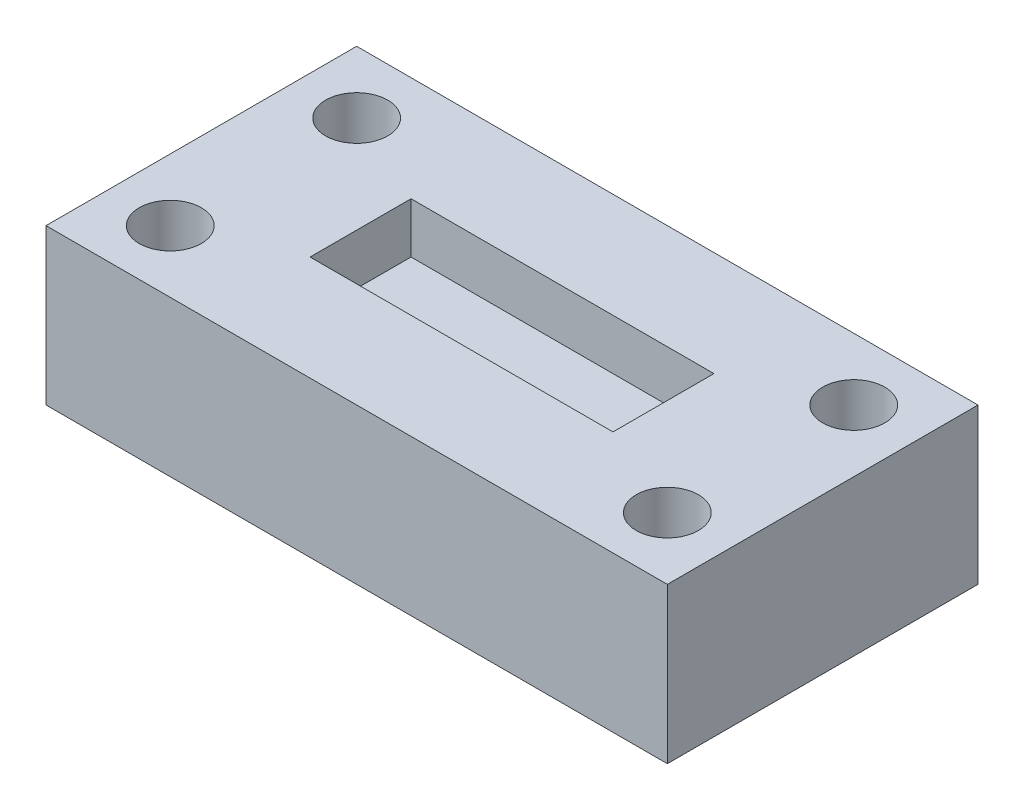
ISO-10303-21;
HEADER;
FILE_DESCRIPTION(('STEP AP214'),'2;1');
FILE_NAME('part.step','',(''),(''),'','','');
FILE_SCHEMA(('AUTOMOTIVE_DESIGN { 1 0 10303 214 1 1 1 1 }'));
ENDSEC;
DATA;
#1=APPLICATION_CONTEXT('core data for automotive mechanical design processes');
#2=APPLICATION_PROTOCOL_DEFINITION('international standard','automotive_design',2000,#1);
#3=PRODUCT_CONTEXT('',#1,'mechanical');
#4=PRODUCT('Part','Part','',(#3));
#5=PRODUCT_RELATED_PRODUCT_CATEGORY('part','',(#4));
#6=PRODUCT_DEFINITION_FORMATION('','',#4);
#7=PRODUCT_DEFINITION_CONTEXT('part definition',#1,'design');
#8=PRODUCT_DEFINITION('design','',#6,#7);
#9=PRODUCT_DEFINITION_SHAPE('','',#8);
#10=(LENGTH_UNIT() NAMED_UNIT(*) SI_UNIT(.MILLI.,.METRE.));
#11=(NAMED_UNIT(*) PLANE_ANGLE_UNIT() SI_UNIT($,.RADIAN.));
#12=(NAMED_UNIT(*) SI_UNIT($,.STERADIAN.) SOLID_ANGLE_UNIT());
#13=UNCERTAINTY_MEASURE_WITH_UNIT(LENGTH_MEASURE(1.E-05),#10,'distance_accuracy_value','');
#14=(GEOMETRIC_REPRESENTATION_CONTEXT(3) GLOBAL_UNCERTAINTY_ASSIGNED_CONTEXT((#13)) GLOBAL_UNIT_ASSIGNED_CONTEXT((#10,
#11,#12)) REPRESENTATION_CONTEXT('',''));
#15=CARTESIAN_POINT('',(0.,0.,0.));
#16=DIRECTION('',(0.,0.,1.));
#17=DIRECTION('',(1.,0.,0.));
#18=AXIS2_PLACEMENT_3D('',#15,#16,#17);
#19=CARTESIAN_POINT('',(0.,-5.,0.));
#20=DIRECTION('',(0.,-1.,0.));
#21=DIRECTION('',(0.,0.,-1.));
#22=AXIS2_PLACEMENT_3D('',#19,#20,#21);
#23=PLANE('',#22);
#24=CARTESIAN_POINT('',(16.,-5.,6.));
#25=DIRECTION('',(0.,1.,0.));
#26=DIRECTION('',(0.,0.,1.));
#27=AXIS2_PLACEMENT_3D('',#24,#25,#26);
#28=CIRCLE('',#27,2.);
#29=CARTESIAN_POINT('',(16.,-5.,8.));
#30=VERTEX_POINT('',#29);
#31=EDGE_CURVE('E200',#30,#30,#28,.T.);
#32=ORIENTED_EDGE('',*,*,#31,.T.);
#33=EDGE_LOOP('',(#32));
#34=FACE_BOUND('',#33,.T.);
#35=CARTESIAN_POINT('',(-16.,-5.,-6.));
#36=DIRECTION('',(0.,1.,0.));
#37=DIRECTION('',(0.,0.,1.));
#38=AXIS2_PLACEMENT_3D('',#35,#36,#37);
#39=CIRCLE('',#38,2.);
#40=CARTESIAN_POINT('',(-16.,-5.,-4.));
#41=VERTEX_POINT('',#40);
#42=EDGE_CURVE('E216',#41,#41,#39,.T.);
#43=ORIENTED_EDGE('',*,*,#42,.T.);
#44=EDGE_LOOP('',(#43));
#45=FACE_BOUND('',#44,.T.);
#46=DIRECTION('',(0.,0.,-1.));
#47=VECTOR('',#46,1.);
#48=CARTESIAN_POINT('',(20.,-5.,10.));
#49=LINE('',#48,#47);
#50=CARTESIAN_POINT('',(20.,-5.,10.));
#51=VERTEX_POINT('',#50);
#52=CARTESIAN_POINT('',(20.,-5.,-10.));
#53=VERTEX_POINT('',#52);
#54=EDGE_CURVE('E224',#51,#53,#49,.T.);
#55=ORIENTED_EDGE('',*,*,#54,.F.);
#56=DIRECTION('',(1.,0.,0.));
#57=VECTOR('',#56,1.);
#58=CARTESIAN_POINT('',(-20.,-5.,10.));
#59=LINE('',#58,#57);
#60=CARTESIAN_POINT('',(-20.,-5.,10.));
#61=VERTEX_POINT('',#60);
#62=EDGE_CURVE('E233',#61,#51,#59,.T.);
#63=ORIENTED_EDGE('',*,*,#62,.F.);
#64=DIRECTION('',(0.,0.,1.));
#65=VECTOR('',#64,1.);
#66=CARTESIAN_POINT('',(-20.,-5.,10.));
#67=LINE('',#66,#65);
#68=CARTESIAN_POINT('',(-20.,-5.,-10.));
#69=VERTEX_POINT('',#68);
#70=EDGE_CURVE('E249',#69,#61,#67,.T.);
#71=ORIENTED_EDGE('',*,*,#70,.F.);
#72=DIRECTION('',(-1.,0.,0.));
#73=VECTOR('',#72,1.);
#74=CARTESIAN_POINT('',(-20.,-5.,-10.));
#75=LINE('',#74,#73);
#76=EDGE_CURVE('E246',#53,#69,#75,.T.);
#77=ORIENTED_EDGE('',*,*,#76,.F.);
#78=EDGE_LOOP('',(#55,#63,#71,#77));
#79=FACE_BOUND('',#78,.T.);
#80=CARTESIAN_POINT('',(16.,-5.,-6.));
#81=DIRECTION('',(0.,1.,0.));
#82=DIRECTION('',(0.,0.,1.));
#83=AXIS2_PLACEMENT_3D('',#80,#81,#82);
#84=CIRCLE('',#83,2.);
#85=CARTESIAN_POINT('',(16.,-5.,-4.));
#86=VERTEX_POINT('',#85);
#87=EDGE_CURVE('E208',#86,#86,#84,.T.);
#88=ORIENTED_EDGE('',*,*,#87,.T.);
#89=EDGE_LOOP('',(#88));
#90=FACE_BOUND('',#89,.T.);
#91=CARTESIAN_POINT('',(-16.,-5.,6.));
#92=DIRECTION('',(0.,1.,0.));
#93=DIRECTION('',(0.,0.,1.));
#94=AXIS2_PLACEMENT_3D('',#91,#92,#93);
#95=CIRCLE('',#94,2.);
#96=CARTESIAN_POINT('',(-16.,-5.,8.));
#97=VERTEX_POINT('',#96);
#98=EDGE_CURVE('E185',#97,#97,#95,.T.);
#99=ORIENTED_EDGE('',*,*,#98,.T.);
#100=EDGE_LOOP('',(#99));
#101=FACE_BOUND('',#100,.T.);
#102=DIRECTION('',(1.,0.,0.));
#103=VECTOR('',#102,1.);
#104=CARTESIAN_POINT('',(0.,-5.,3.25));
#105=LINE('',#104,#103);
#106=CARTESIAN_POINT('',(-9.75,-5.,3.25));
#107=VERTEX_POINT('',#106);
#108=CARTESIAN_POINT('',(9.75,-5.,3.25));
#109=VERTEX_POINT('',#108);
#110=EDGE_CURVE('E285',#107,#109,#105,.T.);
#111=ORIENTED_EDGE('',*,*,#110,.T.);
#112=DIRECTION('',(0.,0.,-1.));
#113=VECTOR('',#112,1.);
#114=CARTESIAN_POINT('',(9.75,-5.,0.));
#115=LINE('',#114,#113);
#116=CARTESIAN_POINT('',(9.75,-5.,-3.25));
#117=VERTEX_POINT('',#116);
#118=EDGE_CURVE('E11',#109,#117,#115,.T.);
#119=ORIENTED_EDGE('',*,*,#118,.T.);
#120=DIRECTION('',(-1.,0.,0.));
#121=VECTOR('',#120,1.);
#122=CARTESIAN_POINT('',(0.,-5.,-3.25));
#123=LINE('',#122,#121);
#124=CARTESIAN_POINT('',(-9.75,-5.,-3.25));
#125=VERTEX_POINT('',#124);
#126=EDGE_CURVE('E48',#117,#125,#123,.T.);
#127=ORIENTED_EDGE('',*,*,#126,.T.);
#128=DIRECTION('',(0.,0.,1.));
#129=VECTOR('',#128,1.);
#130=CARTESIAN_POINT('',(-9.75,-5.,0.));
#131=LINE('',#130,#129);
#132=EDGE_CURVE('E288',#125,#107,#131,.T.);
#133=ORIENTED_EDGE('',*,*,#132,.T.);
#134=EDGE_LOOP('',(#111,#119,#127,#133));
#135=FACE_BOUND('',#134,.T.);
#136=ADVANCED_FACE('F39',(#34,#45,#79,#90,#101,#135),#23,.T.);
#137=CARTESIAN_POINT('',(0.,5.,0.));
#138=DIRECTION('',(0.,-1.,0.));
#139=DIRECTION('',(0.,0.,-1.));
#140=AXIS2_PLACEMENT_3D('',#137,#138,#139);
#141=PLANE('',#140);
#142=DIRECTION('',(1.,0.,0.));
#143=VECTOR('',#142,1.);
#144=CARTESIAN_POINT('',(0.,5.,-3.25));
#145=LINE('',#144,#143);
#146=CARTESIAN_POINT('',(-9.75,5.,-3.25));
#147=VERTEX_POINT('',#146);
#148=CARTESIAN_POINT('',(9.75,5.,-3.25));
#149=VERTEX_POINT('',#148);
#150=EDGE_CURVE('E269',#147,#149,#145,.T.);
#151=ORIENTED_EDGE('',*,*,#150,.T.);
#152=DIRECTION('',(0.,0.,1.));
#153=VECTOR('',#152,1.);
#154=CARTESIAN_POINT('',(9.75,5.,0.));
#155=LINE('',#154,#153);
#156=CARTESIAN_POINT('',(9.75,5.,3.25));
#157=VERTEX_POINT('',#156);
#158=EDGE_CURVE('E281',#149,#157,#155,.T.);
#159=ORIENTED_EDGE('',*,*,#158,.T.);
#160=DIRECTION('',(-1.,0.,0.));
#161=VECTOR('',#160,1.);
#162=CARTESIAN_POINT('',(0.,5.,3.25));
#163=LINE('',#162,#161);
#164=CARTESIAN_POINT('',(-9.75,5.,3.25));
#165=VERTEX_POINT('',#164);
#166=EDGE_CURVE('E277',#157,#165,#163,.T.);
#167=ORIENTED_EDGE('',*,*,#166,.T.);
#168=DIRECTION('',(0.,0.,-1.));
#169=VECTOR('',#168,1.);
#170=CARTESIAN_POINT('',(-9.75,5.,0.));
#171=LINE('',#170,#169);
#172=EDGE_CURVE('E273',#165,#147,#171,.T.);
#173=ORIENTED_EDGE('',*,*,#172,.T.);
#174=EDGE_LOOP('',(#151,#159,#167,#173));
#175=FACE_BOUND('',#174,.T.);
#176=DIRECTION('',(0.,0.,-1.));
#177=VECTOR('',#176,1.);
#178=CARTESIAN_POINT('',(20.,5.,10.));
#179=LINE('',#178,#177);
#180=CARTESIAN_POINT('',(20.,5.,10.));
#181=VERTEX_POINT('',#180);
#182=CARTESIAN_POINT('',(20.,5.,-10.));
#183=VERTEX_POINT('',#182);
#184=EDGE_CURVE('E228',#181,#183,#179,.T.);
#185=ORIENTED_EDGE('',*,*,#184,.T.);
#186=DIRECTION('',(-1.,0.,0.));
#187=VECTOR('',#186,1.);
#188=CARTESIAN_POINT('',(-20.,5.,-10.));
#189=LINE('',#188,#187);
#190=CARTESIAN_POINT('',(-20.,5.,-10.));
#191=VERTEX_POINT('',#190);
#192=EDGE_CURVE('E232',#183,#191,#189,.T.);
#193=ORIENTED_EDGE('',*,*,#192,.T.);
#194=DIRECTION('',(0.,0.,1.));
#195=VECTOR('',#194,1.);
#196=CARTESIAN_POINT('',(-20.,5.,10.));
#197=LINE('',#196,#195);
#198=CARTESIAN_POINT('',(-20.,5.,10.));
#199=VERTEX_POINT('',#198);
#200=EDGE_CURVE('E236',#191,#199,#197,.T.);
#201=ORIENTED_EDGE('',*,*,#200,.T.);
#202=DIRECTION('',(1.,0.,0.));
#203=VECTOR('',#202,1.);
#204=CARTESIAN_POINT('',(-20.,5.,10.));
#205=LINE('',#204,#203);
#206=EDGE_CURVE('E239',#199,#181,#205,.T.);
#207=ORIENTED_EDGE('',*,*,#206,.T.);
#208=EDGE_LOOP('',(#185,#193,#201,#207));
#209=FACE_BOUND('',#208,.T.);
#210=CARTESIAN_POINT('',(-16.,5.,-6.));
#211=DIRECTION('',(0.,1.,0.));
#212=DIRECTION('',(0.,0.,1.));
#213=AXIS2_PLACEMENT_3D('',#210,#211,#212);
#214=CIRCLE('',#213,2.);
#215=CARTESIAN_POINT('',(-16.,5.,-4.));
#216=VERTEX_POINT('',#215);
#217=EDGE_CURVE('E220',#216,#216,#214,.T.);
#218=ORIENTED_EDGE('',*,*,#217,.F.);
#219=EDGE_LOOP('',(#218));
#220=FACE_BOUND('',#219,.T.);
#221=CARTESIAN_POINT('',(16.,5.,-6.));
#222=DIRECTION('',(0.,1.,0.));
#223=DIRECTION('',(0.,0.,1.));
#224=AXIS2_PLACEMENT_3D('',#221,#222,#223);
#225=CIRCLE('',#224,2.);
#226=CARTESIAN_POINT('',(16.,5.,-4.));
#227=VERTEX_POINT('',#226);
#228=EDGE_CURVE('E212',#227,#227,#225,.T.);
#229=ORIENTED_EDGE('',*,*,#228,.F.);
#230=EDGE_LOOP('',(#229));
#231=FACE_BOUND('',#230,.T.);
#232=CARTESIAN_POINT('',(16.,5.,6.));
#233=DIRECTION('',(0.,1.,0.));
#234=DIRECTION('',(0.,0.,1.));
#235=AXIS2_PLACEMENT_3D('',#232,#233,#234);
#236=CIRCLE('',#235,2.);
#237=CARTESIAN_POINT('',(16.,5.,8.));
#238=VERTEX_POINT('',#237);
#239=EDGE_CURVE('E204',#238,#238,#236,.T.);
#240=ORIENTED_EDGE('',*,*,#239,.F.);
#241=EDGE_LOOP('',(#240));
#242=FACE_BOUND('',#241,.T.);
#243=CARTESIAN_POINT('',(-16.,5.,6.));
#244=DIRECTION('',(0.,1.,0.));
#245=DIRECTION('',(0.,0.,1.));
#246=AXIS2_PLACEMENT_3D('',#243,#244,#245);
#247=CIRCLE('',#246,2.);
#248=CARTESIAN_POINT('',(-16.,5.,8.));
#249=VERTEX_POINT('',#248);
#250=EDGE_CURVE('E196',#249,#249,#247,.T.);
#251=ORIENTED_EDGE('',*,*,#250,.F.);
#252=EDGE_LOOP('',(#251));
#253=FACE_BOUND('',#252,.T.);
#254=ADVANCED_FACE('F308',(#175,#209,#220,#231,#242,#253),#141,.F.);
#255=CARTESIAN_POINT('',(20.,5.,10.));
#256=DIRECTION('',(-1.,0.,0.));
#257=DIRECTION('',(0.,0.,1.));
#258=AXIS2_PLACEMENT_3D('',#255,#256,#257);
#259=PLANE('',#258);
#260=ORIENTED_EDGE('',*,*,#54,.T.);
#261=DIRECTION('',(0.,-1.,0.));
#262=VECTOR('',#261,1.);
#263=CARTESIAN_POINT('',(20.,5.,-10.));
#264=LINE('',#263,#262);
#265=EDGE_CURVE('E265',#183,#53,#264,.T.);
#266=ORIENTED_EDGE('',*,*,#265,.F.);
#267=ORIENTED_EDGE('',*,*,#184,.F.);
#268=DIRECTION('',(0.,-1.,0.));
#269=VECTOR('',#268,1.);
#270=CARTESIAN_POINT('',(20.,5.,10.));
#271=LINE('',#270,#269);
#272=EDGE_CURVE('E242',#181,#51,#271,.T.);
#273=ORIENTED_EDGE('',*,*,#272,.T.);
#274=EDGE_LOOP('',(#260,#266,#267,#273));
#275=FACE_BOUND('',#274,.T.);
#276=ADVANCED_FACE('F41',(#275),#259,.F.);
#277=CARTESIAN_POINT('',(-20.,5.,-10.));
#278=DIRECTION('',(0.,0.,1.));
#279=DIRECTION('',(1.,0.,0.));
#280=AXIS2_PLACEMENT_3D('',#277,#278,#279);
#281=PLANE('',#280);
#282=ORIENTED_EDGE('',*,*,#76,.T.);
#283=DIRECTION('',(0.,-1.,0.));
#284=VECTOR('',#283,1.);
#285=CARTESIAN_POINT('',(-20.,5.,-10.));
#286=LINE('',#285,#284);
#287=EDGE_CURVE('E261',#191,#69,#286,.T.);
#288=ORIENTED_EDGE('',*,*,#287,.F.);
#289=ORIENTED_EDGE('',*,*,#192,.F.);
#290=ORIENTED_EDGE('',*,*,#265,.T.);
#291=EDGE_LOOP('',(#282,#288,#289,#290));
#292=FACE_BOUND('',#291,.T.);
#293=ADVANCED_FACE('F326',(#292),#281,.F.);
#294=CARTESIAN_POINT('',(-20.,5.,10.));
#295=DIRECTION('',(1.,0.,0.));
#296=DIRECTION('',(0.,0.,-1.));
#297=AXIS2_PLACEMENT_3D('',#294,#295,#296);
#298=PLANE('',#297);
#299=ORIENTED_EDGE('',*,*,#70,.T.);
#300=DIRECTION('',(0.,-1.,0.));
#301=VECTOR('',#300,1.);
#302=CARTESIAN_POINT('',(-20.,5.,10.));
#303=LINE('',#302,#301);
#304=EDGE_CURVE('E257',#199,#61,#303,.T.);
#305=ORIENTED_EDGE('',*,*,#304,.F.);
#306=ORIENTED_EDGE('',*,*,#200,.F.);
#307=ORIENTED_EDGE('',*,*,#287,.T.);
#308=EDGE_LOOP('',(#299,#305,#306,#307));
#309=FACE_BOUND('',#308,.T.);
#310=ADVANCED_FACE('F323',(#309),#298,.F.);
#311=CARTESIAN_POINT('',(-20.,5.,10.));
#312=DIRECTION('',(0.,0.,-1.));
#313=DIRECTION('',(-1.,0.,0.));
#314=AXIS2_PLACEMENT_3D('',#311,#312,#313);
#315=PLANE('',#314);
#316=ORIENTED_EDGE('',*,*,#62,.T.);
#317=ORIENTED_EDGE('',*,*,#272,.F.);
#318=ORIENTED_EDGE('',*,*,#206,.F.);
#319=ORIENTED_EDGE('',*,*,#304,.T.);
#320=EDGE_LOOP('',(#316,#317,#318,#319));
#321=FACE_BOUND('',#320,.T.);
#322=ADVANCED_FACE('F319',(#321),#315,.F.);
#323=CARTESIAN_POINT('',(-16.,5.,-6.));
#324=DIRECTION('',(0.,-1.,0.));
#325=DIRECTION('',(0.,0.,-1.));
#326=AXIS2_PLACEMENT_3D('',#323,#324,#325);
#327=CYLINDRICAL_SURFACE('',#326,2.);
#328=ORIENTED_EDGE('',*,*,#217,.T.);
#329=EDGE_LOOP('',(#328));
#330=FACE_BOUND('',#329,.T.);
#331=ORIENTED_EDGE('',*,*,#42,.F.);
#332=EDGE_LOOP('',(#331));
#333=FACE_BOUND('',#332,.T.);
#334=ADVANCED_FACE('F322',(#330,#333),#327,.F.);
#335=CARTESIAN_POINT('',(16.,5.,-6.));
#336=DIRECTION('',(0.,-1.,0.));
#337=DIRECTION('',(0.,0.,-1.));
#338=AXIS2_PLACEMENT_3D('',#335,#336,#337);
#339=CYLINDRICAL_SURFACE('',#338,2.);
#340=ORIENTED_EDGE('',*,*,#228,.T.);
#341=EDGE_LOOP('',(#340));
#342=FACE_BOUND('',#341,.T.);
#343=ORIENTED_EDGE('',*,*,#87,.F.);
#344=EDGE_LOOP('',(#343));
#345=FACE_BOUND('',#344,.T.);
#346=ADVANCED_FACE('F371',(#342,#345),#339,.F.);
#347=CARTESIAN_POINT('',(16.,5.,6.));
#348=DIRECTION('',(0.,-1.,0.));
#349=DIRECTION('',(0.,0.,-1.));
#350=AXIS2_PLACEMENT_3D('',#347,#348,#349);
#351=CYLINDRICAL_SURFACE('',#350,2.);
#352=ORIENTED_EDGE('',*,*,#239,.T.);
#353=EDGE_LOOP('',(#352));
#354=FACE_BOUND('',#353,.T.);
#355=ORIENTED_EDGE('',*,*,#31,.F.);
#356=EDGE_LOOP('',(#355));
#357=FACE_BOUND('',#356,.T.);
#358=ADVANCED_FACE('F360',(#354,#357),#351,.F.);
#359=CARTESIAN_POINT('',(-16.,5.,6.));
#360=DIRECTION('',(0.,-1.,0.));
#361=DIRECTION('',(0.,0.,-1.));
#362=AXIS2_PLACEMENT_3D('',#359,#360,#361);
#363=CYLINDRICAL_SURFACE('',#362,2.);
#364=ORIENTED_EDGE('',*,*,#250,.T.);
#365=EDGE_LOOP('',(#364));
#366=FACE_BOUND('',#365,.T.);
#367=ORIENTED_EDGE('',*,*,#98,.F.);
#368=EDGE_LOOP('',(#367));
#369=FACE_BOUND('',#368,.T.);
#370=ADVANCED_FACE('F356',(#366,#369),#363,.F.);
#371=CARTESIAN_POINT('',(9.75,1.75,3.25));
#372=DIRECTION('',(1.,0.,0.));
#373=DIRECTION('',(0.,0.,-1.));
#374=AXIS2_PLACEMENT_3D('',#371,#372,#373);
#375=PLANE('',#374);
#376=DIRECTION('',(0.,1.,0.));
#377=VECTOR('',#376,1.);
#378=CARTESIAN_POINT('',(9.75,1.75,-3.25));
#379=LINE('',#378,#377);
#380=CARTESIAN_POINT('',(9.75,1.75,-3.25));
#381=VERTEX_POINT('',#380);
#382=EDGE_CURVE('E63',#381,#149,#379,.T.);
#383=ORIENTED_EDGE('',*,*,#382,.F.);
#384=DIRECTION('',(0.,0.,-1.));
#385=VECTOR('',#384,1.);
#386=CARTESIAN_POINT('',(9.75,1.75,3.25));
#387=LINE('',#386,#385);
#388=CARTESIAN_POINT('',(9.75,1.75,3.25));
#389=VERTEX_POINT('',#388);
#390=EDGE_CURVE('E159',#389,#381,#387,.T.);
#391=ORIENTED_EDGE('',*,*,#390,.F.);
#392=DIRECTION('',(0.,1.,0.));
#393=VECTOR('',#392,1.);
#394=CARTESIAN_POINT('',(9.75,1.75,3.25));
#395=LINE('',#394,#393);
#396=EDGE_CURVE('E181',#389,#157,#395,.T.);
#397=ORIENTED_EDGE('',*,*,#396,.T.);
#398=ORIENTED_EDGE('',*,*,#158,.F.);
#399=EDGE_LOOP('',(#383,#391,#397,#398));
#400=FACE_BOUND('',#399,.T.);
#401=ADVANCED_FACE('F359',(#400),#375,.F.);
#402=CARTESIAN_POINT('',(-9.75,1.75,3.25));
#403=DIRECTION('',(0.,0.,1.));
#404=DIRECTION('',(1.,0.,0.));
#405=AXIS2_PLACEMENT_3D('',#402,#403,#404);
#406=PLANE('',#405);
#407=ORIENTED_EDGE('',*,*,#396,.F.);
#408=DIRECTION('',(1.,0.,0.));
#409=VECTOR('',#408,1.);
#410=CARTESIAN_POINT('',(-9.75,1.75,3.25));
#411=LINE('',#410,#409);
#412=CARTESIAN_POINT('',(-9.75,1.75,3.25));
#413=VERTEX_POINT('',#412);
#414=EDGE_CURVE('E177',#413,#389,#411,.T.);
#415=ORIENTED_EDGE('',*,*,#414,.F.);
#416=DIRECTION('',(0.,1.,0.));
#417=VECTOR('',#416,1.);
#418=CARTESIAN_POINT('',(-9.75,1.75,3.25));
#419=LINE('',#418,#417);
#420=EDGE_CURVE('E186',#413,#165,#419,.T.);
#421=ORIENTED_EDGE('',*,*,#420,.T.);
#422=ORIENTED_EDGE('',*,*,#166,.F.);
#423=EDGE_LOOP('',(#407,#415,#421,#422));
#424=FACE_BOUND('',#423,.T.);
#425=ADVANCED_FACE('F368',(#424),#406,.F.);
#426=CARTESIAN_POINT('',(-9.75,1.75,3.25));
#427=DIRECTION('',(-1.,0.,0.));
#428=DIRECTION('',(0.,0.,1.));
#429=AXIS2_PLACEMENT_3D('',#426,#427,#428);
#430=PLANE('',#429);
#431=ORIENTED_EDGE('',*,*,#420,.F.);
#432=DIRECTION('',(0.,0.,1.));
#433=VECTOR('',#432,1.);
#434=CARTESIAN_POINT('',(-9.75,1.75,3.25));
#435=LINE('',#434,#433);
#436=CARTESIAN_POINT('',(-9.75,1.75,-3.25));
#437=VERTEX_POINT('',#436);
#438=EDGE_CURVE('E173',#437,#413,#435,.T.);
#439=ORIENTED_EDGE('',*,*,#438,.F.);
#440=DIRECTION('',(0.,1.,0.));
#441=VECTOR('',#440,1.);
#442=CARTESIAN_POINT('',(-9.75,1.75,-3.25));
#443=LINE('',#442,#441);
#444=EDGE_CURVE('E190',#437,#147,#443,.T.);
#445=ORIENTED_EDGE('',*,*,#444,.T.);
#446=ORIENTED_EDGE('',*,*,#172,.F.);
#447=EDGE_LOOP('',(#431,#439,#445,#446));
#448=FACE_BOUND('',#447,.T.);
#449=ADVANCED_FACE('F420',(#448),#430,.F.);
#450=CARTESIAN_POINT('',(-9.75,1.75,-3.25));
#451=DIRECTION('',(0.,0.,-1.));
#452=DIRECTION('',(-1.,0.,0.));
#453=AXIS2_PLACEMENT_3D('',#450,#451,#452);
#454=PLANE('',#453);
#455=ORIENTED_EDGE('',*,*,#444,.F.);
#456=DIRECTION('',(-1.,0.,0.));
#457=VECTOR('',#456,1.);
#458=CARTESIAN_POINT('',(-9.75,1.75,-3.25));
#459=LINE('',#458,#457);
#460=EDGE_CURVE('E169',#381,#437,#459,.T.);
#461=ORIENTED_EDGE('',*,*,#460,.F.);
#462=ORIENTED_EDGE('',*,*,#382,.T.);
#463=ORIENTED_EDGE('',*,*,#150,.F.);
#464=EDGE_LOOP('',(#455,#461,#462,#463));
#465=FACE_BOUND('',#464,.T.);
#466=ADVANCED_FACE('F430',(#465),#454,.F.);
#467=CARTESIAN_POINT('',(0.,1.75,0.));
#468=DIRECTION('',(0.,-1.,0.));
#469=DIRECTION('',(0.,0.,-1.));
#470=AXIS2_PLACEMENT_3D('',#467,#468,#469);
#471=PLANE('',#470);
#472=ORIENTED_EDGE('',*,*,#390,.T.);
#473=ORIENTED_EDGE('',*,*,#460,.T.);
#474=ORIENTED_EDGE('',*,*,#438,.T.);
#475=ORIENTED_EDGE('',*,*,#414,.T.);
#476=EDGE_LOOP('',(#472,#473,#474,#475));
#477=FACE_BOUND('',#476,.T.);
#478=ADVANCED_FACE('F440',(#477),#471,.F.);
#479=CARTESIAN_POINT('',(9.75,-1.75,3.25));
#480=DIRECTION('',(-1.,0.,0.));
#481=DIRECTION('',(0.,0.,1.));
#482=AXIS2_PLACEMENT_3D('',#479,#480,#481);
#483=PLANE('',#482);
#484=DIRECTION('',(0.,-1.,0.));
#485=VECTOR('',#484,1.);
#486=CARTESIAN_POINT('',(9.75,-1.75,3.25));
#487=LINE('',#486,#485);
#488=CARTESIAN_POINT('',(9.75,-1.75,3.25));
#489=VERTEX_POINT('',#488);
#490=EDGE_CURVE('E55',#489,#109,#487,.T.);
#491=ORIENTED_EDGE('',*,*,#490,.F.);
#492=DIRECTION('',(0.,0.,-1.));
#493=VECTOR('',#492,1.);
#494=CARTESIAN_POINT('',(9.75,-1.75,3.25));
#495=LINE('',#494,#493);
#496=CARTESIAN_POINT('',(9.75,-1.75,-3.25));
#497=VERTEX_POINT('',#496);
#498=EDGE_CURVE('E137',#489,#497,#495,.T.);
#499=ORIENTED_EDGE('',*,*,#498,.T.);
#500=DIRECTION('',(0.,-1.,0.));
#501=VECTOR('',#500,1.);
#502=CARTESIAN_POINT('',(9.75,-1.75,-3.25));
#503=LINE('',#502,#501);
#504=EDGE_CURVE('E156',#497,#117,#503,.T.);
#505=ORIENTED_EDGE('',*,*,#504,.T.);
#506=ORIENTED_EDGE('',*,*,#118,.F.);
#507=EDGE_LOOP('',(#491,#499,#505,#506));
#508=FACE_BOUND('',#507,.T.);
#509=ADVANCED_FACE('F141',(#508),#483,.T.);
#510=CARTESIAN_POINT('',(-9.75,-1.75,-3.25));
#511=DIRECTION('',(0.,0.,1.));
#512=DIRECTION('',(1.,0.,0.));
#513=AXIS2_PLACEMENT_3D('',#510,#511,#512);
#514=PLANE('',#513);
#515=ORIENTED_EDGE('',*,*,#504,.F.);
#516=DIRECTION('',(-1.,0.,0.));
#517=VECTOR('',#516,1.);
#518=CARTESIAN_POINT('',(-9.75,-1.75,-3.25));
#519=LINE('',#518,#517);
#520=CARTESIAN_POINT('',(-9.75,-1.75,-3.25));
#521=VERTEX_POINT('',#520);
#522=EDGE_CURVE('E146',#497,#521,#519,.T.);
#523=ORIENTED_EDGE('',*,*,#522,.T.);
#524=DIRECTION('',(0.,-1.,0.));
#525=VECTOR('',#524,1.);
#526=CARTESIAN_POINT('',(-9.75,-1.75,-3.25));
#527=LINE('',#526,#525);
#528=EDGE_CURVE('E160',#521,#125,#527,.T.);
#529=ORIENTED_EDGE('',*,*,#528,.T.);
#530=ORIENTED_EDGE('',*,*,#126,.F.);
#531=EDGE_LOOP('',(#515,#523,#529,#530));
#532=FACE_BOUND('',#531,.T.);
#533=ADVANCED_FACE('F295',(#532),#514,.T.);
#534=CARTESIAN_POINT('',(-9.75,-1.75,3.25));
#535=DIRECTION('',(1.,0.,0.));
#536=DIRECTION('',(0.,0.,-1.));
#537=AXIS2_PLACEMENT_3D('',#534,#535,#536);
#538=PLANE('',#537);
#539=ORIENTED_EDGE('',*,*,#528,.F.);
#540=DIRECTION('',(0.,0.,1.));
#541=VECTOR('',#540,1.);
#542=CARTESIAN_POINT('',(-9.75,-1.75,3.25));
#543=LINE('',#542,#541);
#544=CARTESIAN_POINT('',(-9.75,-1.75,3.25));
#545=VERTEX_POINT('',#544);
#546=EDGE_CURVE('E136',#521,#545,#543,.T.);
#547=ORIENTED_EDGE('',*,*,#546,.T.);
#548=DIRECTION('',(0.,-1.,0.));
#549=VECTOR('',#548,1.);
#550=CARTESIAN_POINT('',(-9.75,-1.75,3.25));
#551=LINE('',#550,#549);
#552=EDGE_CURVE('E131',#545,#107,#551,.T.);
#553=ORIENTED_EDGE('',*,*,#552,.T.);
#554=ORIENTED_EDGE('',*,*,#132,.F.);
#555=EDGE_LOOP('',(#539,#547,#553,#554));
#556=FACE_BOUND('',#555,.T.);
#557=ADVANCED_FACE('F298',(#556),#538,.T.);
#558=CARTESIAN_POINT('',(-9.75,-1.75,3.25));
#559=DIRECTION('',(0.,0.,-1.));
#560=DIRECTION('',(-1.,0.,0.));
#561=AXIS2_PLACEMENT_3D('',#558,#559,#560);
#562=PLANE('',#561);
#563=ORIENTED_EDGE('',*,*,#552,.F.);
#564=DIRECTION('',(1.,0.,0.));
#565=VECTOR('',#564,1.);
#566=CARTESIAN_POINT('',(-9.75,-1.75,3.25));
#567=LINE('',#566,#565);
#568=EDGE_CURVE('E128',#545,#489,#567,.T.);
#569=ORIENTED_EDGE('',*,*,#568,.T.);
#570=ORIENTED_EDGE('',*,*,#490,.T.);
#571=ORIENTED_EDGE('',*,*,#110,.F.);
#572=EDGE_LOOP('',(#563,#569,#570,#571));
#573=FACE_BOUND('',#572,.T.);
#574=ADVANCED_FACE('F129',(#573),#562,.T.);
#575=CARTESIAN_POINT('',(0.,-1.75,0.));
#576=DIRECTION('',(0.,1.,0.));
#577=DIRECTION('',(0.,0.,-1.));
#578=AXIS2_PLACEMENT_3D('',#575,#576,#577);
#579=PLANE('',#578);
#580=ORIENTED_EDGE('',*,*,#498,.F.);
#581=ORIENTED_EDGE('',*,*,#568,.F.);
#582=ORIENTED_EDGE('',*,*,#546,.F.);
#583=ORIENTED_EDGE('',*,*,#522,.F.);
#584=EDGE_LOOP('',(#580,#581,#582,#583));
#585=FACE_BOUND('',#584,.T.);
#586=ADVANCED_FACE('F148',(#585),#579,.F.);
#587=CLOSED_SHELL('',(#136,#254,#276,#293,#310,#322,#334,#346,#358,#370,#401,#425,#449,#466,
#478,#509,#533,#557,#574,#586));
#588=MANIFOLD_SOLID_BREP('B2',#587);
#589=ADVANCED_BREP_SHAPE_REPRESENTATION('',(#18,#588),#14);
#590=SHAPE_DEFINITION_REPRESENTATION(#9,#589);
ENDSEC;
END-ISO-10303-21;
